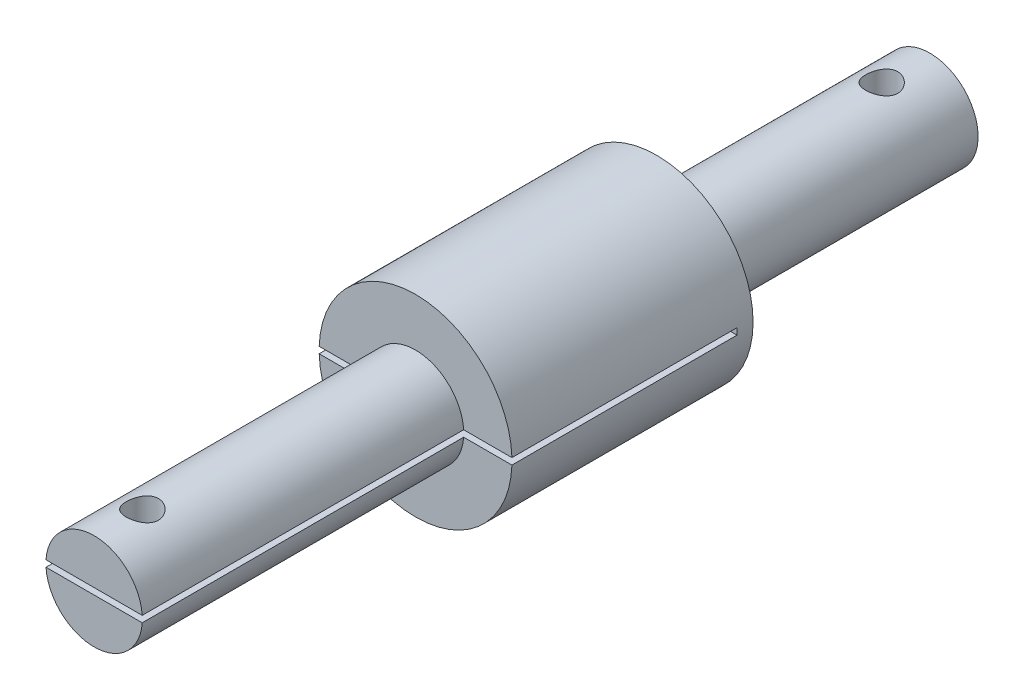
ISO-10303-21;
HEADER;
FILE_DESCRIPTION(('STEP AP214'),'2;1');
FILE_NAME('part.step','',(''),(''),'','','');
FILE_SCHEMA(('AUTOMOTIVE_DESIGN { 1 0 10303 214 1 1 1 1 }'));
ENDSEC;
DATA;
#1=APPLICATION_CONTEXT('core data for automotive mechanical design processes');
#2=APPLICATION_PROTOCOL_DEFINITION('international standard','automotive_design',2000,#1);
#3=PRODUCT_CONTEXT('',#1,'mechanical');
#4=PRODUCT('Part','Part','',(#3));
#5=PRODUCT_RELATED_PRODUCT_CATEGORY('part','',(#4));
#6=PRODUCT_DEFINITION_FORMATION('','',#4);
#7=PRODUCT_DEFINITION_CONTEXT('part definition',#1,'design');
#8=PRODUCT_DEFINITION('design','',#6,#7);
#9=PRODUCT_DEFINITION_SHAPE('','',#8);
#10=(LENGTH_UNIT() NAMED_UNIT(*) SI_UNIT(.MILLI.,.METRE.));
#11=(NAMED_UNIT(*) PLANE_ANGLE_UNIT() SI_UNIT($,.RADIAN.));
#12=(NAMED_UNIT(*) SI_UNIT($,.STERADIAN.) SOLID_ANGLE_UNIT());
#13=UNCERTAINTY_MEASURE_WITH_UNIT(LENGTH_MEASURE(1.E-05),#10,'distance_accuracy_value','');
#14=(GEOMETRIC_REPRESENTATION_CONTEXT(3) GLOBAL_UNCERTAINTY_ASSIGNED_CONTEXT((#13)) GLOBAL_UNIT_ASSIGNED_CONTEXT((#10,
#11,#12)) REPRESENTATION_CONTEXT('',''));
#15=CARTESIAN_POINT('',(0.,0.,0.));
#16=DIRECTION('',(0.,0.,1.));
#17=DIRECTION('',(1.,0.,0.));
#18=AXIS2_PLACEMENT_3D('',#15,#16,#17);
#19=CARTESIAN_POINT('',(0.,0.,35.));
#20=DIRECTION('',(0.,0.,-1.));
#21=DIRECTION('',(-1.,0.,0.));
#22=AXIS2_PLACEMENT_3D('',#19,#20,#21);
#23=CYLINDRICAL_SURFACE('',#22,3.);
#24=CARTESIAN_POINT('',(0.,3.,31.));
#25=CARTESIAN_POINT('',(-0.0545633628867235,3.00000015300943,30.9999997462684));
#26=CARTESIAN_POINT('',(-0.10912519453855,2.99849769507545,31.0044802661272));
#27=CARTESIAN_POINT('',(-0.216641760872973,2.99265210203281,31.0222291088172));
#28=CARTESIAN_POINT('',(-0.269596328118818,2.98830867202153,31.0354983439489));
#29=CARTESIAN_POINT('',(-0.372332789501776,2.97725307906443,31.0703192433841));
#30=CARTESIAN_POINT('',(-0.422119825886035,2.97054487730853,31.0918570624593));
#31=CARTESIAN_POINT('',(-0.517374936805325,2.95544445717342,31.1425411728383));
#32=CARTESIAN_POINT('',(-0.562842156958706,2.94705190667778,31.1716889650026));
#33=CARTESIAN_POINT('',(-0.649741675022266,2.92914094443005,31.2378258048588));
#34=CARTESIAN_POINT('',(-0.69100370029831,2.91959556463785,31.2750312342605));
#35=CARTESIAN_POINT('',(-0.766832692702084,2.90060314783121,31.3557671547066));
#36=CARTESIAN_POINT('',(-0.801398185489462,2.89115613290549,31.3992990349285));
#37=CARTESIAN_POINT('',(-0.863824942227858,2.87313332477274,31.4929851151965));
#38=CARTESIAN_POINT('',(-0.891464858221032,2.86459039275688,31.5432937397321));
#39=CARTESIAN_POINT('',(-0.937818873877722,2.84975305418601,31.6481760944586));
#40=CARTESIAN_POINT('',(-0.956535697386767,2.84345796160746,31.7027485171627));
#41=CARTESIAN_POINT('',(-0.983873461509166,2.83411303269377,31.8126732214967));
#42=CARTESIAN_POINT('',(-0.992813448271772,2.83096095769611,31.8679372084891));
#43=CARTESIAN_POINT('',(-1.00134112333448,2.82795656629508,31.9792637541559));
#44=CARTESIAN_POINT('',(-1.00093170160472,2.8281032302273,32.0353260607092));
#45=CARTESIAN_POINT('',(-0.991019903703419,2.8315901500818,32.143936630444));
#46=CARTESIAN_POINT('',(-0.981933913166995,2.83478415867533,32.196528402919));
#47=CARTESIAN_POINT('',(-0.955606162849417,2.84376657724551,32.2993934196068));
#48=CARTESIAN_POINT('',(-0.938363426591871,2.84955529784108,32.3496663854351));
#49=CARTESIAN_POINT('',(-0.895939058060212,2.86317911131249,32.4474127495915));
#50=CARTESIAN_POINT('',(-0.870634048707264,2.87104565793117,32.4948280254695));
#51=CARTESIAN_POINT('',(-0.81288910630314,2.88792558575726,32.5848709082797));
#52=CARTESIAN_POINT('',(-0.780447112364006,2.89693929790464,32.6274971269334));
#53=CARTESIAN_POINT('',(-0.707349332682236,2.91567329167741,32.7090915981608));
#54=CARTESIAN_POINT('',(-0.666353150076309,2.92540589354843,32.7477526945091));
#55=CARTESIAN_POINT('',(-0.578339569970061,2.94406938387037,32.8177312666634));
#56=CARTESIAN_POINT('',(-0.531321595660812,2.95300019538067,32.8490480381645));
#57=CARTESIAN_POINT('',(-0.431947613046266,2.96917107937794,32.9036963002351));
#58=CARTESIAN_POINT('',(-0.379543276416335,2.97639350008039,32.9269454913407));
#59=CARTESIAN_POINT('',(-0.271269083364506,2.98820567144435,32.9642031739557));
#60=CARTESIAN_POINT('',(-0.215400438154953,2.99279633654879,32.9782148754234));
#61=CARTESIAN_POINT('',(-0.104383829529304,2.99867627071441,32.9960556660224));
#62=CARTESIAN_POINT('',(-0.0493095998648451,3.00010001833731,33.0002998091728));
#63=CARTESIAN_POINT('',(0.0607750699602367,2.99988902694825,32.9996673264015));
#64=CARTESIAN_POINT('',(0.115785519319647,2.99825480419352,32.9947922400201));
#65=CARTESIAN_POINT('',(0.22251986630426,2.99220024717114,32.976388092264));
#66=CARTESIAN_POINT('',(0.274292806834859,2.98786198711228,32.9631137939505));
#67=CARTESIAN_POINT('',(0.374855958579563,2.97691846830034,32.9286065555333));
#68=CARTESIAN_POINT('',(0.423645788508561,2.97031292046541,32.9073726005323));
#69=CARTESIAN_POINT('',(0.518288296393322,2.95528931287427,32.8569295681591));
#70=CARTESIAN_POINT('',(0.564029959217331,2.94682814756305,32.8275254067164));
#71=CARTESIAN_POINT('',(0.650064830135405,2.92905253915743,32.7618058499869));
#72=CARTESIAN_POINT('',(0.690356367794894,2.91973783591888,32.7254883439698));
#73=CARTESIAN_POINT('',(0.766252507807013,2.90076847982472,32.6450212489917));
#74=CARTESIAN_POINT('',(0.80156096924849,2.89111761095155,32.6005907730668));
#75=CARTESIAN_POINT('',(0.864257522320852,2.87299973286981,32.5062284321955));
#76=CARTESIAN_POINT('',(0.891645547920841,2.8645327335312,32.4562965213898));
#77=CARTESIAN_POINT('',(0.937596930423359,2.84982391820308,32.3523269846934));
#78=CARTESIAN_POINT('',(0.956178132197765,2.84357760900632,32.2982979207572));
#79=CARTESIAN_POINT('',(0.983894666792163,2.83410832399133,32.1876213498759));
#80=CARTESIAN_POINT('',(0.993034254961244,2.83088398622698,32.1309750345669));
#81=CARTESIAN_POINT('',(1.00127628247038,2.82797858875071,32.0198029039868));
#82=CARTESIAN_POINT('',(1.00087025731093,2.82812400344299,31.9653176597483));
#83=CARTESIAN_POINT('',(0.991242293454879,2.8315126992356,31.8572349251003));
#84=CARTESIAN_POINT('',(0.982020879458888,2.83475579595884,31.8036373820471));
#85=CARTESIAN_POINT('',(0.955371813126982,2.84384524278943,31.6998643369873));
#86=CARTESIAN_POINT('',(0.938103346014882,2.84964098015514,31.6496431749928));
#87=CARTESIAN_POINT('',(0.895979365760382,2.86316398825434,31.5527725930645));
#88=CARTESIAN_POINT('',(0.871122168553976,2.87089168765297,31.5061239688127));
#89=CARTESIAN_POINT('',(0.813260692583244,2.8878282922406,31.4155163300763));
#90=CARTESIAN_POINT('',(0.779948242764528,2.89708711641604,31.3717634981014));
#91=CARTESIAN_POINT('',(0.706642883135695,2.91583356283786,31.290310186616));
#92=CARTESIAN_POINT('',(0.666648084451494,2.92532124912518,31.252611424312));
#93=CARTESIAN_POINT('',(0.579241556920675,2.94390030525393,31.1828555877108));
#94=CARTESIAN_POINT('',(0.531601513499725,2.95296181801216,31.151075652249));
#95=CARTESIAN_POINT('',(0.431357357406628,2.96925991172652,31.0960095711494));
#96=CARTESIAN_POINT('',(0.378754518132348,2.9764969590794,31.072721254078));
#97=CARTESIAN_POINT('',(0.272493647200973,2.98805515068532,31.0362783675113));
#98=CARTESIAN_POINT('',(0.218987757676407,2.9924921242252,31.0227175337366));
#99=CARTESIAN_POINT('',(0.110320416010247,2.99846407064225,31.0045797193229));
#100=CARTESIAN_POINT('',(0.0551594255687462,2.99999984531906,31.0000002565035));
#101=CARTESIAN_POINT('',(0.,3.,31.));
#102=B_SPLINE_CURVE_WITH_KNOTS('',3,(#24,#25,#26,#27,#28,#29,#30,#31,#32,#33,#34,#35,#36,#37,
#38,#39,#40,#41,#42,#43,#44,#45,#46,#47,#48,#49,#50,#51,#52,#53,#54,#55,#56,#57,#58,#59,#60,#61,
#62,#63,#64,#65,#66,#67,#68,#69,#70,#71,#72,#73,#74,#75,#76,#77,#78,#79,#80,#81,#82,#83,#84,#85,
#86,#87,#88,#89,#90,#91,#92,#93,#94,#95,#96,#97,#98,#99,#100,#101),.UNSPECIFIED.,.T.,.F.,(4,2,2,
2,2,2,2,2,2,2,2,2,2,2,2,2,2,2,2,2,2,2,2,2,2,2,2,2,2,2,2,2,2,2,2,2,2,2,4),(0.,0.163487106026011,
0.326991185267521,0.490222672870275,0.653486377799101,0.821846842827558,0.9902443328753,
1.16348384823471,1.33667044692834,1.50401925741841,1.67131633987486,1.83096826551281,
1.99063930855482,2.15288171155131,2.31517102558208,2.48593305811368,2.65671145966619,
2.82918405650358,3.00159668877209,3.1665358317517,3.33144713164177,3.49158157978214,
3.65173645284104,3.81610399843737,3.98052180821892,4.15241022880751,4.32430008234996,
4.49584013824416,4.66730284700846,4.82995666056618,4.99260079341185,5.15215587070227,
5.31174638165789,5.47830066681616,5.64490211113589,5.81799660824911,5.99104681142267,
6.15636558363624,6.3216386602795),.UNSPECIFIED.);
#103=CARTESIAN_POINT('',(0.,3.,31.));
#104=VERTEX_POINT('',#103);
#105=EDGE_CURVE('E123',#104,#104,#102,.T.);
#106=ORIENTED_EDGE('',*,*,#105,.F.);
#107=EDGE_LOOP('',(#106));
#108=FACE_BOUND('',#107,.T.);
#109=CARTESIAN_POINT('',(0.,0.,35.));
#110=DIRECTION('',(0.,0.,1.));
#111=DIRECTION('',(1.,0.,0.));
#112=AXIS2_PLACEMENT_3D('',#109,#110,#111);
#113=CIRCLE('',#112,3.);
#114=CARTESIAN_POINT('',(2.99332590941915,0.2,35.));
#115=VERTEX_POINT('',#114);
#116=CARTESIAN_POINT('',(-2.99332590941916,0.2,35.));
#117=VERTEX_POINT('',#116);
#118=EDGE_CURVE('E117',#115,#117,#113,.T.);
#119=ORIENTED_EDGE('',*,*,#118,.F.);
#120=DIRECTION('',(0.,0.,-1.));
#121=VECTOR('',#120,1.);
#122=CARTESIAN_POINT('',(2.99332590941915,0.2,35.));
#123=LINE('',#122,#121);
#124=CARTESIAN_POINT('',(2.99332590941915,0.2,15.));
#125=VERTEX_POINT('',#124);
#126=EDGE_CURVE('E146',#115,#125,#123,.T.);
#127=ORIENTED_EDGE('',*,*,#126,.T.);
#128=CARTESIAN_POINT('',(0.,0.,15.));
#129=DIRECTION('',(0.,0.,1.));
#130=DIRECTION('',(1.,0.,0.));
#131=AXIS2_PLACEMENT_3D('',#128,#129,#130);
#132=CIRCLE('',#131,3.);
#133=CARTESIAN_POINT('',(-2.99332590941915,0.2,15.));
#134=VERTEX_POINT('',#133);
#135=EDGE_CURVE('E128',#125,#134,#132,.T.);
#136=ORIENTED_EDGE('',*,*,#135,.T.);
#137=DIRECTION('',(0.,0.,-1.));
#138=VECTOR('',#137,1.);
#139=CARTESIAN_POINT('',(-2.99332590941915,0.2,35.));
#140=LINE('',#139,#138);
#141=EDGE_CURVE('E240',#134,#117,#140,.F.);
#142=ORIENTED_EDGE('',*,*,#141,.T.);
#143=EDGE_LOOP('',(#119,#127,#136,#142));
#144=FACE_BOUND('',#143,.T.);
#145=ADVANCED_FACE('F35',(#108,#144),#23,.T.);
#146=CARTESIAN_POINT('',(0.,0.,15.));
#147=DIRECTION('',(0.,0.,1.));
#148=DIRECTION('',(1.,0.,0.));
#149=AXIS2_PLACEMENT_3D('',#146,#147,#148);
#150=PLANE('',#149);
#151=DIRECTION('',(-1.,0.,0.));
#152=VECTOR('',#151,1.);
#153=CARTESIAN_POINT('',(0.,0.2,15.));
#154=LINE('',#153,#152);
#155=CARTESIAN_POINT('',(5.99666574022598,0.2,15.));
#156=VERTEX_POINT('',#155);
#157=EDGE_CURVE('E58',#156,#125,#154,.T.);
#158=ORIENTED_EDGE('',*,*,#157,.F.);
#159=CARTESIAN_POINT('',(0.,0.,15.));
#160=DIRECTION('',(0.,0.,1.));
#161=DIRECTION('',(1.,0.,0.));
#162=AXIS2_PLACEMENT_3D('',#159,#160,#161);
#163=CIRCLE('',#162,6.);
#164=CARTESIAN_POINT('',(-5.99666574022598,0.2,15.));
#165=VERTEX_POINT('',#164);
#166=EDGE_CURVE('E131',#156,#165,#163,.T.);
#167=ORIENTED_EDGE('',*,*,#166,.T.);
#168=EDGE_CURVE('E229',#134,#165,#154,.T.);
#169=ORIENTED_EDGE('',*,*,#168,.F.);
#170=ORIENTED_EDGE('',*,*,#135,.F.);
#171=EDGE_LOOP('',(#158,#167,#169,#170));
#172=FACE_BOUND('',#171,.T.);
#173=ADVANCED_FACE('F173',(#172),#150,.T.);
#174=CARTESIAN_POINT('',(0.,0.,35.));
#175=DIRECTION('',(0.,0.,1.));
#176=DIRECTION('',(1.,0.,0.));
#177=AXIS2_PLACEMENT_3D('',#174,#175,#176);
#178=PLANE('',#177);
#179=DIRECTION('',(-1.,0.,0.));
#180=VECTOR('',#179,1.);
#181=CARTESIAN_POINT('',(-7.46051596763665,0.2,35.));
#182=LINE('',#181,#180);
#183=EDGE_CURVE('E104',#115,#117,#182,.T.);
#184=ORIENTED_EDGE('',*,*,#183,.F.);
#185=ORIENTED_EDGE('',*,*,#118,.T.);
#186=EDGE_LOOP('',(#184,#185));
#187=FACE_BOUND('',#186,.T.);
#188=ADVANCED_FACE('F171',(#187),#178,.T.);
#189=CARTESIAN_POINT('',(0.,10.,32.));
#190=DIRECTION('',(0.,-1.,0.));
#191=DIRECTION('',(0.,0.,-1.));
#192=AXIS2_PLACEMENT_3D('',#189,#190,#191);
#193=CYLINDRICAL_SURFACE('',#192,1.);
#194=CARTESIAN_POINT('',(0.,0.200000000000001,32.));
#195=DIRECTION('',(0.,1.,0.));
#196=DIRECTION('',(0.,0.,1.));
#197=AXIS2_PLACEMENT_3D('',#194,#195,#196);
#198=CIRCLE('',#197,1.);
#199=CARTESIAN_POINT('',(0.,0.200000000000001,33.));
#200=VERTEX_POINT('',#199);
#201=EDGE_CURVE('E227',#200,#200,#198,.T.);
#202=ORIENTED_EDGE('',*,*,#201,.F.);
#203=EDGE_LOOP('',(#202));
#204=FACE_BOUND('',#203,.T.);
#205=ORIENTED_EDGE('',*,*,#105,.T.);
#206=EDGE_LOOP('',(#205));
#207=FACE_BOUND('',#206,.T.);
#208=ADVANCED_FACE('F186',(#204,#207),#193,.F.);
#209=CARTESIAN_POINT('',(-2.99332590941915,-0.2,35.));
#210=VERTEX_POINT('',#209);
#211=CARTESIAN_POINT('',(2.99332590941915,-0.2,35.));
#212=VERTEX_POINT('',#211);
#213=EDGE_CURVE('E110',#210,#212,#113,.T.);
#214=ORIENTED_EDGE('',*,*,#213,.F.);
#215=DIRECTION('',(0.,0.,-1.));
#216=VECTOR('',#215,1.);
#217=CARTESIAN_POINT('',(-2.99332590941915,-0.2,35.));
#218=LINE('',#217,#216);
#219=CARTESIAN_POINT('',(-2.99332590941915,-0.2,15.));
#220=VERTEX_POINT('',#219);
#221=EDGE_CURVE('E50',#210,#220,#218,.T.);
#222=ORIENTED_EDGE('',*,*,#221,.T.);
#223=CARTESIAN_POINT('',(2.99332590941915,-0.2,15.));
#224=VERTEX_POINT('',#223);
#225=EDGE_CURVE('E112',#220,#224,#132,.T.);
#226=ORIENTED_EDGE('',*,*,#225,.T.);
#227=DIRECTION('',(0.,0.,-1.));
#228=VECTOR('',#227,1.);
#229=CARTESIAN_POINT('',(2.99332590941915,-0.2,35.));
#230=LINE('',#229,#228);
#231=EDGE_CURVE('E99',#224,#212,#230,.F.);
#232=ORIENTED_EDGE('',*,*,#231,.T.);
#233=EDGE_LOOP('',(#214,#222,#226,#232));
#234=FACE_BOUND('',#233,.T.);
#235=CARTESIAN_POINT('',(0.,-3.,31.));
#236=CARTESIAN_POINT('',(0.0545633628867235,-3.00000015300943,30.9999997462684));
#237=CARTESIAN_POINT('',(0.10912519453855,-2.99849769507545,31.0044802661272));
#238=CARTESIAN_POINT('',(0.216641760872973,-2.99265210203281,31.0222291088172));
#239=CARTESIAN_POINT('',(0.269596328118818,-2.98830867202153,31.0354983439489));
#240=CARTESIAN_POINT('',(0.372332789501776,-2.97725307906443,31.0703192433841));
#241=CARTESIAN_POINT('',(0.422119825886035,-2.97054487730853,31.0918570624593));
#242=CARTESIAN_POINT('',(0.517374936805325,-2.95544445717342,31.1425411728383));
#243=CARTESIAN_POINT('',(0.562842156958706,-2.94705190667778,31.1716889650026));
#244=CARTESIAN_POINT('',(0.649741675022266,-2.92914094443005,31.2378258048588));
#245=CARTESIAN_POINT('',(0.69100370029831,-2.91959556463785,31.2750312342605));
#246=CARTESIAN_POINT('',(0.766832692702084,-2.90060314783121,31.3557671547066));
#247=CARTESIAN_POINT('',(0.801398185489462,-2.89115613290549,31.3992990349285));
#248=CARTESIAN_POINT('',(0.863824942227858,-2.87313332477274,31.4929851151965));
#249=CARTESIAN_POINT('',(0.891464858221032,-2.86459039275688,31.5432937397321));
#250=CARTESIAN_POINT('',(0.937818873877722,-2.84975305418601,31.6481760944586));
#251=CARTESIAN_POINT('',(0.956535697386767,-2.84345796160746,31.7027485171627));
#252=CARTESIAN_POINT('',(0.983873461509166,-2.83411303269377,31.8126732214967));
#253=CARTESIAN_POINT('',(0.992813448271772,-2.83096095769611,31.8679372084891));
#254=CARTESIAN_POINT('',(1.00134112333448,-2.82795656629508,31.9792637541559));
#255=CARTESIAN_POINT('',(1.00093170160472,-2.8281032302273,32.0353260607092));
#256=CARTESIAN_POINT('',(0.991019903703419,-2.8315901500818,32.143936630444));
#257=CARTESIAN_POINT('',(0.981933913166995,-2.83478415867533,32.196528402919));
#258=CARTESIAN_POINT('',(0.955606162849417,-2.84376657724551,32.2993934196068));
#259=CARTESIAN_POINT('',(0.938363426591871,-2.84955529784108,32.3496663854351));
#260=CARTESIAN_POINT('',(0.895939058060212,-2.86317911131249,32.4474127495915));
#261=CARTESIAN_POINT('',(0.870634048707264,-2.87104565793117,32.4948280254695));
#262=CARTESIAN_POINT('',(0.81288910630314,-2.88792558575726,32.5848709082797));
#263=CARTESIAN_POINT('',(0.780447112364006,-2.89693929790464,32.6274971269334));
#264=CARTESIAN_POINT('',(0.707349332682236,-2.91567329167741,32.7090915981608));
#265=CARTESIAN_POINT('',(0.666353150076309,-2.92540589354843,32.7477526945091));
#266=CARTESIAN_POINT('',(0.578339569970061,-2.94406938387037,32.8177312666634));
#267=CARTESIAN_POINT('',(0.531321595660812,-2.95300019538067,32.8490480381645));
#268=CARTESIAN_POINT('',(0.431947613046266,-2.96917107937794,32.9036963002351));
#269=CARTESIAN_POINT('',(0.379543276416335,-2.97639350008039,32.9269454913407));
#270=CARTESIAN_POINT('',(0.271269083364506,-2.98820567144435,32.9642031739557));
#271=CARTESIAN_POINT('',(0.215400438154953,-2.99279633654879,32.9782148754234));
#272=CARTESIAN_POINT('',(0.104383829529304,-2.99867627071441,32.9960556660224));
#273=CARTESIAN_POINT('',(0.0493095998648451,-3.00010001833731,33.0002998091728));
#274=CARTESIAN_POINT('',(-0.0607750699602367,-2.99988902694825,32.9996673264015));
#275=CARTESIAN_POINT('',(-0.115785519319647,-2.99825480419352,32.9947922400201));
#276=CARTESIAN_POINT('',(-0.22251986630426,-2.99220024717114,32.976388092264));
#277=CARTESIAN_POINT('',(-0.274292806834859,-2.98786198711228,32.9631137939505));
#278=CARTESIAN_POINT('',(-0.374855958579563,-2.97691846830034,32.9286065555333));
#279=CARTESIAN_POINT('',(-0.423645788508561,-2.97031292046541,32.9073726005323));
#280=CARTESIAN_POINT('',(-0.518288296393322,-2.95528931287427,32.8569295681591));
#281=CARTESIAN_POINT('',(-0.564029959217331,-2.94682814756305,32.8275254067164));
#282=CARTESIAN_POINT('',(-0.650064830135405,-2.92905253915743,32.7618058499869));
#283=CARTESIAN_POINT('',(-0.690356367794894,-2.91973783591888,32.7254883439698));
#284=CARTESIAN_POINT('',(-0.766252507807013,-2.90076847982472,32.6450212489917));
#285=CARTESIAN_POINT('',(-0.80156096924849,-2.89111761095155,32.6005907730668));
#286=CARTESIAN_POINT('',(-0.864257522320852,-2.87299973286981,32.5062284321955));
#287=CARTESIAN_POINT('',(-0.891645547920841,-2.8645327335312,32.4562965213898));
#288=CARTESIAN_POINT('',(-0.937596930423359,-2.84982391820308,32.3523269846934));
#289=CARTESIAN_POINT('',(-0.956178132197765,-2.84357760900632,32.2982979207572));
#290=CARTESIAN_POINT('',(-0.983894666792163,-2.83410832399133,32.1876213498759));
#291=CARTESIAN_POINT('',(-0.993034254961244,-2.83088398622698,32.1309750345669));
#292=CARTESIAN_POINT('',(-1.00127628247038,-2.82797858875071,32.0198029039868));
#293=CARTESIAN_POINT('',(-1.00087025731093,-2.82812400344299,31.9653176597483));
#294=CARTESIAN_POINT('',(-0.991242293454879,-2.8315126992356,31.8572349251003));
#295=CARTESIAN_POINT('',(-0.982020879458888,-2.83475579595884,31.8036373820471));
#296=CARTESIAN_POINT('',(-0.955371813126982,-2.84384524278943,31.6998643369873));
#297=CARTESIAN_POINT('',(-0.938103346014882,-2.84964098015514,31.6496431749928));
#298=CARTESIAN_POINT('',(-0.895979365760382,-2.86316398825434,31.5527725930645));
#299=CARTESIAN_POINT('',(-0.871122168553976,-2.87089168765297,31.5061239688127));
#300=CARTESIAN_POINT('',(-0.813260692583244,-2.8878282922406,31.4155163300763));
#301=CARTESIAN_POINT('',(-0.779948242764528,-2.89708711641604,31.3717634981014));
#302=CARTESIAN_POINT('',(-0.706642883135695,-2.91583356283786,31.290310186616));
#303=CARTESIAN_POINT('',(-0.666648084451494,-2.92532124912518,31.252611424312));
#304=CARTESIAN_POINT('',(-0.579241556920675,-2.94390030525393,31.1828555877108));
#305=CARTESIAN_POINT('',(-0.531601513499725,-2.95296181801216,31.151075652249));
#306=CARTESIAN_POINT('',(-0.431357357406628,-2.96925991172652,31.0960095711494));
#307=CARTESIAN_POINT('',(-0.378754518132348,-2.9764969590794,31.072721254078));
#308=CARTESIAN_POINT('',(-0.272493647200973,-2.98805515068532,31.0362783675113));
#309=CARTESIAN_POINT('',(-0.218987757676407,-2.9924921242252,31.0227175337366));
#310=CARTESIAN_POINT('',(-0.110320416010247,-2.99846407064225,31.0045797193229));
#311=CARTESIAN_POINT('',(-0.0551594255687462,-2.99999984531906,31.0000002565035));
#312=CARTESIAN_POINT('',(0.,-3.,31.));
#313=B_SPLINE_CURVE_WITH_KNOTS('',3,(#235,#236,#237,#238,#239,#240,#241,#242,#243,#244,#245,
#246,#247,#248,#249,#250,#251,#252,#253,#254,#255,#256,#257,#258,#259,#260,#261,#262,#263,#264,
#265,#266,#267,#268,#269,#270,#271,#272,#273,#274,#275,#276,#277,#278,#279,#280,#281,#282,#283,
#284,#285,#286,#287,#288,#289,#290,#291,#292,#293,#294,#295,#296,#297,#298,#299,#300,#301,#302,
#303,#304,#305,#306,#307,#308,#309,#310,#311,#312),.UNSPECIFIED.,.T.,.F.,(4,2,2,2,2,2,2,2,2,2,2,
2,2,2,2,2,2,2,2,2,2,2,2,2,2,2,2,2,2,2,2,2,2,2,2,2,2,2,4),(0.,0.163487106026011,
0.326991185267521,0.490222672870275,0.653486377799101,0.821846842827558,0.9902443328753,
1.16348384823471,1.33667044692834,1.50401925741841,1.67131633987486,1.83096826551281,
1.99063930855482,2.15288171155131,2.31517102558208,2.48593305811368,2.65671145966619,
2.82918405650358,3.00159668877209,3.1665358317517,3.33144713164177,3.49158157978214,
3.65173645284104,3.81610399843737,3.98052180821892,4.15241022880751,4.32430008234996,
4.49584013824416,4.66730284700846,4.82995666056618,4.99260079341185,5.15215587070227,
5.31174638165789,5.47830066681616,5.64490211113589,5.81799660824911,5.99104681142267,
6.15636558363624,6.3216386602795),.UNSPECIFIED.);
#314=CARTESIAN_POINT('',(0.,-3.,31.));
#315=VERTEX_POINT('',#314);
#316=EDGE_CURVE('E214',#315,#315,#313,.T.);
#317=ORIENTED_EDGE('',*,*,#316,.F.);
#318=EDGE_LOOP('',(#317));
#319=FACE_BOUND('',#318,.T.);
#320=ADVANCED_FACE('F108',(#234,#319),#23,.T.);
#321=CARTESIAN_POINT('',(0.,0.,-17.));
#322=DIRECTION('',(0.,0.,1.));
#323=DIRECTION('',(1.,0.,0.));
#324=AXIS2_PLACEMENT_3D('',#321,#322,#323);
#325=CYLINDRICAL_SURFACE('',#324,3.);
#326=CARTESIAN_POINT('',(0.,0.,-17.));
#327=DIRECTION('',(0.,0.,-1.));
#328=DIRECTION('',(-1.,0.,0.));
#329=AXIS2_PLACEMENT_3D('',#326,#327,#328);
#330=CIRCLE('',#329,3.);
#331=CARTESIAN_POINT('',(-3.,0.,-17.));
#332=VERTEX_POINT('',#331);
#333=EDGE_CURVE('E118',#332,#332,#330,.T.);
#334=ORIENTED_EDGE('',*,*,#333,.F.);
#335=EDGE_LOOP('',(#334));
#336=FACE_BOUND('',#335,.T.);
#337=CARTESIAN_POINT('',(0.,0.,0.));
#338=DIRECTION('',(0.,0.,-1.));
#339=DIRECTION('',(-1.,0.,0.));
#340=AXIS2_PLACEMENT_3D('',#337,#338,#339);
#341=CIRCLE('',#340,3.);
#342=CARTESIAN_POINT('',(-3.,0.,0.));
#343=VERTEX_POINT('',#342);
#344=EDGE_CURVE('E127',#343,#343,#341,.T.);
#345=ORIENTED_EDGE('',*,*,#344,.T.);
#346=EDGE_LOOP('',(#345));
#347=FACE_BOUND('',#346,.T.);
#348=CARTESIAN_POINT('',(0.,-3.,-15.));
#349=CARTESIAN_POINT('',(0.0545633628867237,-3.00000015300943,-15.0000002537316));
#350=CARTESIAN_POINT('',(0.10912519453855,-2.99849769507545,-14.9955197338728));
#351=CARTESIAN_POINT('',(0.216641760872973,-2.99265210203281,-14.9777708911828));
#352=CARTESIAN_POINT('',(0.269596328118818,-2.98830867202153,-14.9645016560511));
#353=CARTESIAN_POINT('',(0.372332789501777,-2.97725307906443,-14.929680756616));
#354=CARTESIAN_POINT('',(0.422119825886035,-2.97054487730853,-14.9081429375407));
#355=CARTESIAN_POINT('',(0.517374936805326,-2.95544445717342,-14.8574588271617));
#356=CARTESIAN_POINT('',(0.562842156958706,-2.94705190667778,-14.8283110349974));
#357=CARTESIAN_POINT('',(0.649741675022267,-2.92914094443005,-14.7621741951412));
#358=CARTESIAN_POINT('',(0.69100370029831,-2.91959556463785,-14.7249687657395));
#359=CARTESIAN_POINT('',(0.766832692702085,-2.90060314783122,-14.6442328452934));
#360=CARTESIAN_POINT('',(0.801398185489464,-2.89115613290549,-14.6007009650715));
#361=CARTESIAN_POINT('',(0.86382494222786,-2.87313332477274,-14.5070148848035));
#362=CARTESIAN_POINT('',(0.891464858221033,-2.86459039275688,-14.4567062602679));
#363=CARTESIAN_POINT('',(0.937818873877723,-2.84975305418601,-14.3518239055415));
#364=CARTESIAN_POINT('',(0.956535697386766,-2.84345796160746,-14.2972514828373));
#365=CARTESIAN_POINT('',(0.983873461509165,-2.83411303269377,-14.1873267785033));
#366=CARTESIAN_POINT('',(0.99281344827177,-2.83096095769611,-14.1320627915109));
#367=CARTESIAN_POINT('',(1.00134112333448,-2.82795656629508,-14.0207362458441));
#368=CARTESIAN_POINT('',(1.00093170160472,-2.8281032302273,-13.9646739392908));
#369=CARTESIAN_POINT('',(0.99101990370342,-2.8315901500818,-13.856063369556));
#370=CARTESIAN_POINT('',(0.981933913166995,-2.83478415867533,-13.803471597081));
#371=CARTESIAN_POINT('',(0.955606162849417,-2.84376657724551,-13.7006065803932));
#372=CARTESIAN_POINT('',(0.938363426591871,-2.84955529784108,-13.6503336145649));
#373=CARTESIAN_POINT('',(0.895939058060211,-2.86317911131249,-13.5525872504085));
#374=CARTESIAN_POINT('',(0.870634048707263,-2.87104565793117,-13.5051719745305));
#375=CARTESIAN_POINT('',(0.81288910630314,-2.88792558575726,-13.4151290917203));
#376=CARTESIAN_POINT('',(0.780447112364007,-2.89693929790464,-13.3725028730666));
#377=CARTESIAN_POINT('',(0.707349332682239,-2.91567329167741,-13.2909084018392));
#378=CARTESIAN_POINT('',(0.666353150076313,-2.92540589354843,-13.2522473054909));
#379=CARTESIAN_POINT('',(0.578339569970065,-2.94406938387037,-13.1822687333366));
#380=CARTESIAN_POINT('',(0.531321595660816,-2.95300019538067,-13.1509519618355));
#381=CARTESIAN_POINT('',(0.431947613046268,-2.96917107937794,-13.0963036997649));
#382=CARTESIAN_POINT('',(0.379543276416337,-2.97639350008039,-13.0730545086593));
#383=CARTESIAN_POINT('',(0.271269083364508,-2.98820567144435,-13.0357968260443));
#384=CARTESIAN_POINT('',(0.215400438154955,-2.99279633654879,-13.0217851245766));
#385=CARTESIAN_POINT('',(0.104383829529305,-2.99867627071441,-13.0039443339776));
#386=CARTESIAN_POINT('',(0.0493095998648461,-3.00010001833731,-12.9997001908273));
#387=CARTESIAN_POINT('',(-0.0607750699602359,-2.99988902694825,-13.0003326735985));
#388=CARTESIAN_POINT('',(-0.115785519319647,-2.99825480419352,-13.0052077599799));
#389=CARTESIAN_POINT('',(-0.222519866304259,-2.99220024717114,-13.023611907736));
#390=CARTESIAN_POINT('',(-0.274292806834856,-2.98786198711228,-13.0368862060495));
#391=CARTESIAN_POINT('',(-0.37485595857956,-2.97691846830034,-13.0713934444667));
#392=CARTESIAN_POINT('',(-0.423645788508559,-2.97031292046541,-13.0926273994677));
#393=CARTESIAN_POINT('',(-0.518288296393321,-2.95528931287427,-13.1430704318409));
#394=CARTESIAN_POINT('',(-0.564029959217329,-2.94682814756305,-13.1724745932836));
#395=CARTESIAN_POINT('',(-0.650064830135403,-2.92905253915743,-13.2381941500131));
#396=CARTESIAN_POINT('',(-0.690356367794893,-2.91973783591888,-13.2745116560302));
#397=CARTESIAN_POINT('',(-0.766252507807014,-2.90076847982472,-13.3549787510083));
#398=CARTESIAN_POINT('',(-0.801560969248492,-2.89111761095155,-13.3994092269333));
#399=CARTESIAN_POINT('',(-0.864257522320854,-2.87299973286981,-13.4937715678045));
#400=CARTESIAN_POINT('',(-0.891645547920843,-2.8645327335312,-13.5437034786102));
#401=CARTESIAN_POINT('',(-0.937596930423361,-2.84982391820308,-13.6476730153066));
#402=CARTESIAN_POINT('',(-0.956178132197767,-2.84357760900632,-13.7017020792428));
#403=CARTESIAN_POINT('',(-0.983894666792163,-2.83410832399133,-13.8123786501242));
#404=CARTESIAN_POINT('',(-0.993034254961244,-2.83088398622698,-13.8690249654331));
#405=CARTESIAN_POINT('',(-1.00127628247038,-2.82797858875071,-13.9801970960132));
#406=CARTESIAN_POINT('',(-1.00087025731093,-2.82812400344299,-14.0346823402517));
#407=CARTESIAN_POINT('',(-0.991242293454878,-2.8315126992356,-14.1427650748997));
#408=CARTESIAN_POINT('',(-0.982020879458887,-2.83475579595884,-14.1963626179529));
#409=CARTESIAN_POINT('',(-0.95537181312698,-2.84384524278943,-14.3001356630127));
#410=CARTESIAN_POINT('',(-0.938103346014879,-2.84964098015514,-14.3503568250072));
#411=CARTESIAN_POINT('',(-0.895979365760382,-2.86316398825434,-14.4472274069355));
#412=CARTESIAN_POINT('',(-0.871122168553979,-2.87089168765297,-14.4938760311873));
#413=CARTESIAN_POINT('',(-0.813260692583249,-2.8878282922406,-14.5844836699237));
#414=CARTESIAN_POINT('',(-0.779948242764533,-2.89708711641604,-14.6282365018986));
#415=CARTESIAN_POINT('',(-0.706642883135698,-2.91583356283786,-14.709689813384));
#416=CARTESIAN_POINT('',(-0.666648084451495,-2.92532124912518,-14.747388575688));
#417=CARTESIAN_POINT('',(-0.579241556920674,-2.94390030525393,-14.8171444122892));
#418=CARTESIAN_POINT('',(-0.531601513499725,-2.95296181801216,-14.848924347751));
#419=CARTESIAN_POINT('',(-0.431357357406628,-2.96925991172652,-14.9039904288506));
#420=CARTESIAN_POINT('',(-0.378754518132349,-2.9764969590794,-14.927278745922));
#421=CARTESIAN_POINT('',(-0.272493647200975,-2.98805515068532,-14.9637216324887));
#422=CARTESIAN_POINT('',(-0.218987757676408,-2.9924921242252,-14.9772824662634));
#423=CARTESIAN_POINT('',(-0.110320416010247,-2.99846407064225,-14.9954202806771));
#424=CARTESIAN_POINT('',(-0.055159425568746,-2.99999984531906,-14.9999997434965));
#425=CARTESIAN_POINT('',(0.,-3.,-15.));
#426=B_SPLINE_CURVE_WITH_KNOTS('',3,(#348,#349,#350,#351,#352,#353,#354,#355,#356,#357,#358,
#359,#360,#361,#362,#363,#364,#365,#366,#367,#368,#369,#370,#371,#372,#373,#374,#375,#376,#377,
#378,#379,#380,#381,#382,#383,#384,#385,#386,#387,#388,#389,#390,#391,#392,#393,#394,#395,#396,
#397,#398,#399,#400,#401,#402,#403,#404,#405,#406,#407,#408,#409,#410,#411,#412,#413,#414,#415,
#416,#417,#418,#419,#420,#421,#422,#423,#424,#425),.UNSPECIFIED.,.T.,.F.,(4,2,2,2,2,2,2,2,2,2,2,
2,2,2,2,2,2,2,2,2,2,2,2,2,2,2,2,2,2,2,2,2,2,2,2,2,2,2,4),(0.,0.163487106026011,
0.326991185267521,0.490222672870274,0.653486377799101,0.821846842827561,0.990244332875303,
1.16348384823471,1.33667044692833,1.5040192574184,1.67131633987485,1.8309682655128,
1.99063930855482,2.15288171155131,2.31517102558207,2.48593305811367,2.65671145966618,
2.82918405650358,3.00159668877208,3.1665358317517,3.33144713164177,3.49158157978214,
3.65173645284104,3.81610399843737,3.98052180821891,4.15241022880752,4.32430008234997,
4.49584013824417,4.66730284700846,4.82995666056619,4.99260079341185,5.15215587070228,
5.31174638165788,5.47830066681615,5.64490211113589,5.81799660824911,5.99104681142266,
6.15636558363624,6.3216386602795),.UNSPECIFIED.);
#427=CARTESIAN_POINT('',(0.,-3.,-15.));
#428=VERTEX_POINT('',#427);
#429=EDGE_CURVE('E137',#428,#428,#426,.T.);
#430=ORIENTED_EDGE('',*,*,#429,.F.);
#431=EDGE_LOOP('',(#430));
#432=FACE_BOUND('',#431,.T.);
#433=CARTESIAN_POINT('',(0.,3.,-15.));
#434=CARTESIAN_POINT('',(-0.0545633628867229,3.00000015300943,-15.0000002537316));
#435=CARTESIAN_POINT('',(-0.109125194538549,2.99849769507545,-14.9955197338728));
#436=CARTESIAN_POINT('',(-0.216641760872972,2.99265210203281,-14.9777708911828));
#437=CARTESIAN_POINT('',(-0.269596328118818,2.98830867202153,-14.9645016560511));
#438=CARTESIAN_POINT('',(-0.372332789501776,2.97725307906443,-14.929680756616));
#439=CARTESIAN_POINT('',(-0.422119825886034,2.97054487730853,-14.9081429375407));
#440=CARTESIAN_POINT('',(-0.517374936805325,2.95544445717342,-14.8574588271617));
#441=CARTESIAN_POINT('',(-0.562842156958706,2.94705190667778,-14.8283110349974));
#442=CARTESIAN_POINT('',(-0.649741675022266,2.92914094443005,-14.7621741951412));
#443=CARTESIAN_POINT('',(-0.691003700298309,2.91959556463785,-14.7249687657395));
#444=CARTESIAN_POINT('',(-0.766832692702084,2.90060314783122,-14.6442328452934));
#445=CARTESIAN_POINT('',(-0.801398185489462,2.89115613290549,-14.6007009650715));
#446=CARTESIAN_POINT('',(-0.863824942227859,2.87313332477274,-14.5070148848035));
#447=CARTESIAN_POINT('',(-0.891464858221032,2.86459039275688,-14.4567062602679));
#448=CARTESIAN_POINT('',(-0.937818873877722,2.84975305418601,-14.3518239055415));
#449=CARTESIAN_POINT('',(-0.956535697386765,2.84345796160746,-14.2972514828373));
#450=CARTESIAN_POINT('',(-0.983873461509164,2.83411303269377,-14.1873267785033));
#451=CARTESIAN_POINT('',(-0.992813448271769,2.83096095769611,-14.1320627915109));
#452=CARTESIAN_POINT('',(-1.00134112333448,2.82795656629508,-14.0207362458441));
#453=CARTESIAN_POINT('',(-1.00093170160472,2.8281032302273,-13.9646739392908));
#454=CARTESIAN_POINT('',(-0.991019903703419,2.8315901500818,-13.856063369556));
#455=CARTESIAN_POINT('',(-0.981933913166994,2.83478415867533,-13.803471597081));
#456=CARTESIAN_POINT('',(-0.955606162849417,2.84376657724551,-13.7006065803932));
#457=CARTESIAN_POINT('',(-0.938363426591871,2.84955529784108,-13.6503336145649));
#458=CARTESIAN_POINT('',(-0.895939058060211,2.86317911131249,-13.5525872504085));
#459=CARTESIAN_POINT('',(-0.870634048707263,2.87104565793117,-13.5051719745305));
#460=CARTESIAN_POINT('',(-0.812889106303139,2.88792558575726,-13.4151290917203));
#461=CARTESIAN_POINT('',(-0.780447112364006,2.89693929790464,-13.3725028730666));
#462=CARTESIAN_POINT('',(-0.707349332682239,2.91567329167741,-13.2909084018392));
#463=CARTESIAN_POINT('',(-0.666353150076313,2.92540589354843,-13.2522473054909));
#464=CARTESIAN_POINT('',(-0.578339569970065,2.94406938387037,-13.1822687333366));
#465=CARTESIAN_POINT('',(-0.531321595660815,2.95300019538067,-13.1509519618355));
#466=CARTESIAN_POINT('',(-0.431947613046267,2.96917107937794,-13.0963036997649));
#467=CARTESIAN_POINT('',(-0.379543276416336,2.97639350008039,-13.0730545086593));
#468=CARTESIAN_POINT('',(-0.271269083364507,2.98820567144435,-13.0357968260443));
#469=CARTESIAN_POINT('',(-0.215400438154954,2.99279633654879,-13.0217851245766));
#470=CARTESIAN_POINT('',(-0.104383829529304,2.99867627071441,-13.0039443339776));
#471=CARTESIAN_POINT('',(-0.0493095998648451,3.00010001833731,-12.9997001908273));
#472=CARTESIAN_POINT('',(0.0607750699602368,2.99988902694825,-13.0003326735985));
#473=CARTESIAN_POINT('',(0.115785519319647,2.99825480419352,-13.0052077599799));
#474=CARTESIAN_POINT('',(0.222519866304259,2.99220024717114,-13.023611907736));
#475=CARTESIAN_POINT('',(0.274292806834856,2.98786198711228,-13.0368862060495));
#476=CARTESIAN_POINT('',(0.374855958579561,2.97691846830034,-13.0713934444667));
#477=CARTESIAN_POINT('',(0.42364578850856,2.97031292046541,-13.0926273994677));
#478=CARTESIAN_POINT('',(0.518288296393322,2.95528931287427,-13.1430704318409));
#479=CARTESIAN_POINT('',(0.56402995921733,2.94682814756305,-13.1724745932836));
#480=CARTESIAN_POINT('',(0.650064830135404,2.92905253915743,-13.2381941500131));
#481=CARTESIAN_POINT('',(0.690356367794894,2.91973783591888,-13.2745116560302));
#482=CARTESIAN_POINT('',(0.766252507807014,2.90076847982472,-13.3549787510083));
#483=CARTESIAN_POINT('',(0.801560969248493,2.89111761095155,-13.3994092269333));
#484=CARTESIAN_POINT('',(0.864257522320855,2.87299973286981,-13.4937715678045));
#485=CARTESIAN_POINT('',(0.891645547920844,2.8645327335312,-13.5437034786102));
#486=CARTESIAN_POINT('',(0.937596930423362,2.84982391820308,-13.6476730153066));
#487=CARTESIAN_POINT('',(0.956178132197767,2.84357760900632,-13.7017020792428));
#488=CARTESIAN_POINT('',(0.983894666792164,2.83410832399133,-13.8123786501242));
#489=CARTESIAN_POINT('',(0.993034254961245,2.83088398622698,-13.8690249654331));
#490=CARTESIAN_POINT('',(1.00127628247038,2.82797858875071,-13.9801970960132));
#491=CARTESIAN_POINT('',(1.00087025731093,2.82812400344299,-14.0346823402517));
#492=CARTESIAN_POINT('',(0.991242293454878,2.8315126992356,-14.1427650748997));
#493=CARTESIAN_POINT('',(0.982020879458888,2.83475579595884,-14.1963626179529));
#494=CARTESIAN_POINT('',(0.955371813126981,2.84384524278943,-14.3001356630127));
#495=CARTESIAN_POINT('',(0.938103346014881,2.84964098015514,-14.3503568250072));
#496=CARTESIAN_POINT('',(0.895979365760383,2.86316398825434,-14.4472274069355));
#497=CARTESIAN_POINT('',(0.87112216855398,2.87089168765297,-14.4938760311873));
#498=CARTESIAN_POINT('',(0.81326069258325,2.8878282922406,-14.5844836699237));
#499=CARTESIAN_POINT('',(0.779948242764534,2.89708711641604,-14.6282365018986));
#500=CARTESIAN_POINT('',(0.706642883135699,2.91583356283786,-14.709689813384));
#501=CARTESIAN_POINT('',(0.666648084451496,2.92532124912518,-14.747388575688));
#502=CARTESIAN_POINT('',(0.579241556920675,2.94390030525393,-14.8171444122892));
#503=CARTESIAN_POINT('',(0.531601513499726,2.95296181801216,-14.848924347751));
#504=CARTESIAN_POINT('',(0.431357357406629,2.96925991172652,-14.9039904288506));
#505=CARTESIAN_POINT('',(0.37875451813235,2.9764969590794,-14.927278745922));
#506=CARTESIAN_POINT('',(0.272493647200976,2.98805515068532,-14.9637216324887));
#507=CARTESIAN_POINT('',(0.218987757676409,2.9924921242252,-14.9772824662634));
#508=CARTESIAN_POINT('',(0.110320416010248,2.99846407064224,-14.9954202806771));
#509=CARTESIAN_POINT('',(0.0551594255687469,2.99999984531906,-14.9999997434965));
#510=CARTESIAN_POINT('',(0.,3.,-15.));
#511=B_SPLINE_CURVE_WITH_KNOTS('',3,(#433,#434,#435,#436,#437,#438,#439,#440,#441,#442,#443,
#444,#445,#446,#447,#448,#449,#450,#451,#452,#453,#454,#455,#456,#457,#458,#459,#460,#461,#462,
#463,#464,#465,#466,#467,#468,#469,#470,#471,#472,#473,#474,#475,#476,#477,#478,#479,#480,#481,
#482,#483,#484,#485,#486,#487,#488,#489,#490,#491,#492,#493,#494,#495,#496,#497,#498,#499,#500,
#501,#502,#503,#504,#505,#506,#507,#508,#509,#510),.UNSPECIFIED.,.T.,.F.,(4,2,2,2,2,2,2,2,2,2,2,
2,2,2,2,2,2,2,2,2,2,2,2,2,2,2,2,2,2,2,2,2,2,2,2,2,2,2,4),(0.,0.163487106026011,
0.326991185267521,0.490222672870274,0.653486377799101,0.821846842827561,0.990244332875303,
1.16348384823471,1.33667044692833,1.5040192574184,1.67131633987485,1.8309682655128,
1.99063930855482,2.15288171155131,2.31517102558207,2.48593305811367,2.65671145966618,
2.82918405650358,3.00159668877208,3.1665358317517,3.33144713164177,3.49158157978214,
3.65173645284104,3.81610399843737,3.98052180821891,4.15241022880752,4.32430008234997,
4.49584013824417,4.66730284700846,4.82995666056619,4.99260079341185,5.15215587070228,
5.31174638165788,5.47830066681615,5.64490211113589,5.81799660824911,5.99104681142266,
6.15636558363624,6.3216386602795),.UNSPECIFIED.);
#512=CARTESIAN_POINT('',(0.,3.,-15.));
#513=VERTEX_POINT('',#512);
#514=EDGE_CURVE('E145',#513,#513,#511,.T.);
#515=ORIENTED_EDGE('',*,*,#514,.F.);
#516=EDGE_LOOP('',(#515));
#517=FACE_BOUND('',#516,.T.);
#518=ADVANCED_FACE('F151',(#336,#347,#432,#517),#325,.T.);
#519=CARTESIAN_POINT('',(0.,0.,15.));
#520=DIRECTION('',(0.,0.,-1.));
#521=DIRECTION('',(-1.,0.,0.));
#522=AXIS2_PLACEMENT_3D('',#519,#520,#521);
#523=CYLINDRICAL_SURFACE('',#522,6.);
#524=CARTESIAN_POINT('',(0.,0.,1.));
#525=DIRECTION('',(0.,0.,1.));
#526=DIRECTION('',(1.,0.,0.));
#527=AXIS2_PLACEMENT_3D('',#524,#525,#526);
#528=CIRCLE('',#527,6.);
#529=CARTESIAN_POINT('',(-5.99666574022598,0.2,1.));
#530=VERTEX_POINT('',#529);
#531=CARTESIAN_POINT('',(-5.99666574022598,-0.2,1.));
#532=VERTEX_POINT('',#531);
#533=EDGE_CURVE('E11',#530,#532,#528,.T.);
#534=ORIENTED_EDGE('',*,*,#533,.F.);
#535=DIRECTION('',(0.,0.,-1.));
#536=VECTOR('',#535,1.);
#537=CARTESIAN_POINT('',(-5.99666574022598,0.2,15.));
#538=LINE('',#537,#536);
#539=EDGE_CURVE('E231',#530,#165,#538,.F.);
#540=ORIENTED_EDGE('',*,*,#539,.T.);
#541=ORIENTED_EDGE('',*,*,#166,.F.);
#542=DIRECTION('',(0.,0.,-1.));
#543=VECTOR('',#542,1.);
#544=CARTESIAN_POINT('',(5.99666574022598,0.2,15.));
#545=LINE('',#544,#543);
#546=CARTESIAN_POINT('',(5.99666574022598,0.2,1.));
#547=VERTEX_POINT('',#546);
#548=EDGE_CURVE('E243',#156,#547,#545,.T.);
#549=ORIENTED_EDGE('',*,*,#548,.T.);
#550=CARTESIAN_POINT('',(5.99666574022598,-0.2,1.));
#551=VERTEX_POINT('',#550);
#552=EDGE_CURVE('E39',#551,#547,#528,.T.);
#553=ORIENTED_EDGE('',*,*,#552,.F.);
#554=DIRECTION('',(0.,0.,-1.));
#555=VECTOR('',#554,1.);
#556=CARTESIAN_POINT('',(5.99666574022598,-0.2,15.));
#557=LINE('',#556,#555);
#558=CARTESIAN_POINT('',(5.99666574022598,-0.2,15.));
#559=VERTEX_POINT('',#558);
#560=EDGE_CURVE('E114',#551,#559,#557,.F.);
#561=ORIENTED_EDGE('',*,*,#560,.T.);
#562=CARTESIAN_POINT('',(-5.99666574022598,-0.2,15.));
#563=VERTEX_POINT('',#562);
#564=EDGE_CURVE('E134',#563,#559,#163,.T.);
#565=ORIENTED_EDGE('',*,*,#564,.F.);
#566=DIRECTION('',(0.,0.,-1.));
#567=VECTOR('',#566,1.);
#568=CARTESIAN_POINT('',(-5.99666574022598,-0.2,15.));
#569=LINE('',#568,#567);
#570=EDGE_CURVE('E233',#563,#532,#569,.T.);
#571=ORIENTED_EDGE('',*,*,#570,.T.);
#572=EDGE_LOOP('',(#534,#540,#541,#549,#553,#561,#565,#571));
#573=FACE_BOUND('',#572,.T.);
#574=CARTESIAN_POINT('',(0.,0.,0.));
#575=DIRECTION('',(0.,0.,1.));
#576=DIRECTION('',(1.,0.,0.));
#577=AXIS2_PLACEMENT_3D('',#574,#575,#576);
#578=CIRCLE('',#577,6.);
#579=CARTESIAN_POINT('',(6.,0.,0.));
#580=VERTEX_POINT('',#579);
#581=EDGE_CURVE('E121',#580,#580,#578,.T.);
#582=ORIENTED_EDGE('',*,*,#581,.T.);
#583=EDGE_LOOP('',(#582));
#584=FACE_BOUND('',#583,.T.);
#585=ADVANCED_FACE('F37',(#573,#584),#523,.T.);
#586=DIRECTION('',(1.,0.,0.));
#587=VECTOR('',#586,1.);
#588=CARTESIAN_POINT('',(0.,-0.2,15.));
#589=LINE('',#588,#587);
#590=EDGE_CURVE('E113',#563,#220,#589,.T.);
#591=ORIENTED_EDGE('',*,*,#590,.F.);
#592=ORIENTED_EDGE('',*,*,#564,.T.);
#593=EDGE_CURVE('E225',#224,#559,#589,.T.);
#594=ORIENTED_EDGE('',*,*,#593,.F.);
#595=ORIENTED_EDGE('',*,*,#225,.F.);
#596=EDGE_LOOP('',(#591,#592,#594,#595));
#597=FACE_BOUND('',#596,.T.);
#598=ADVANCED_FACE('F181',(#597),#150,.T.);
#599=CARTESIAN_POINT('',(0.,0.,0.));
#600=DIRECTION('',(0.,0.,1.));
#601=DIRECTION('',(1.,0.,0.));
#602=AXIS2_PLACEMENT_3D('',#599,#600,#601);
#603=PLANE('',#602);
#604=ORIENTED_EDGE('',*,*,#344,.F.);
#605=EDGE_LOOP('',(#604));
#606=FACE_BOUND('',#605,.T.);
#607=ORIENTED_EDGE('',*,*,#581,.F.);
#608=EDGE_LOOP('',(#607));
#609=FACE_BOUND('',#608,.T.);
#610=ADVANCED_FACE('F170',(#606,#609),#603,.F.);
#611=DIRECTION('',(1.,0.,0.));
#612=VECTOR('',#611,1.);
#613=CARTESIAN_POINT('',(-7.46051596763665,-0.2,35.));
#614=LINE('',#613,#612);
#615=EDGE_CURVE('E96',#210,#212,#614,.T.);
#616=ORIENTED_EDGE('',*,*,#615,.F.);
#617=ORIENTED_EDGE('',*,*,#213,.T.);
#618=EDGE_LOOP('',(#616,#617));
#619=FACE_BOUND('',#618,.T.);
#620=ADVANCED_FACE('F116',(#619),#178,.T.);
#621=CARTESIAN_POINT('',(0.,0.,-17.));
#622=DIRECTION('',(0.,0.,-1.));
#623=DIRECTION('',(-1.,0.,0.));
#624=AXIS2_PLACEMENT_3D('',#621,#622,#623);
#625=PLANE('',#624);
#626=ORIENTED_EDGE('',*,*,#333,.T.);
#627=EDGE_LOOP('',(#626));
#628=FACE_BOUND('',#627,.T.);
#629=ADVANCED_FACE('F160',(#628),#625,.T.);
#630=CARTESIAN_POINT('',(0.,10.,-14.));
#631=DIRECTION('',(0.,-1.,0.));
#632=DIRECTION('',(0.,0.,-1.));
#633=AXIS2_PLACEMENT_3D('',#630,#631,#632);
#634=CYLINDRICAL_SURFACE('',#633,1.);
#635=ORIENTED_EDGE('',*,*,#429,.T.);
#636=EDGE_LOOP('',(#635));
#637=FACE_BOUND('',#636,.T.);
#638=ORIENTED_EDGE('',*,*,#514,.T.);
#639=EDGE_LOOP('',(#638));
#640=FACE_BOUND('',#639,.T.);
#641=ADVANCED_FACE('F155',(#637,#640),#634,.F.);
#642=CARTESIAN_POINT('',(0.,-0.200000000000001,32.));
#643=DIRECTION('',(0.,-1.,0.));
#644=DIRECTION('',(0.,0.,-1.));
#645=AXIS2_PLACEMENT_3D('',#642,#643,#644);
#646=CIRCLE('',#645,1.);
#647=CARTESIAN_POINT('',(0.,-0.200000000000001,31.));
#648=VERTEX_POINT('',#647);
#649=EDGE_CURVE('E211',#648,#648,#646,.T.);
#650=ORIENTED_EDGE('',*,*,#649,.F.);
#651=EDGE_LOOP('',(#650));
#652=FACE_BOUND('',#651,.T.);
#653=ORIENTED_EDGE('',*,*,#316,.T.);
#654=EDGE_LOOP('',(#653));
#655=FACE_BOUND('',#654,.T.);
#656=ADVANCED_FACE('F159',(#652,#655),#193,.F.);
#657=CARTESIAN_POINT('',(0.,0.,1.));
#658=DIRECTION('',(0.,0.,1.));
#659=DIRECTION('',(1.,0.,0.));
#660=AXIS2_PLACEMENT_3D('',#657,#658,#659);
#661=PLANE('',#660);
#662=ORIENTED_EDGE('',*,*,#533,.T.);
#663=DIRECTION('',(1.,0.,0.));
#664=VECTOR('',#663,1.);
#665=CARTESIAN_POINT('',(-7.46051596763665,-0.2,1.));
#666=LINE('',#665,#664);
#667=EDGE_CURVE('E259',#532,#551,#666,.T.);
#668=ORIENTED_EDGE('',*,*,#667,.T.);
#669=ORIENTED_EDGE('',*,*,#552,.T.);
#670=DIRECTION('',(-1.,0.,0.));
#671=VECTOR('',#670,1.);
#672=CARTESIAN_POINT('',(-7.46051596763665,0.2,1.));
#673=LINE('',#672,#671);
#674=EDGE_CURVE('E226',#547,#530,#673,.T.);
#675=ORIENTED_EDGE('',*,*,#674,.T.);
#676=EDGE_LOOP('',(#662,#668,#669,#675));
#677=FACE_BOUND('',#676,.T.);
#678=ADVANCED_FACE('F200',(#677),#661,.T.);
#679=CARTESIAN_POINT('',(-7.46051596763665,0.2,1.));
#680=DIRECTION('',(0.,1.,0.));
#681=DIRECTION('',(0.,0.,1.));
#682=AXIS2_PLACEMENT_3D('',#679,#680,#681);
#683=PLANE('',#682);
#684=ORIENTED_EDGE('',*,*,#201,.T.);
#685=EDGE_LOOP('',(#684));
#686=FACE_BOUND('',#685,.T.);
#687=ORIENTED_EDGE('',*,*,#183,.T.);
#688=ORIENTED_EDGE('',*,*,#141,.F.);
#689=ORIENTED_EDGE('',*,*,#168,.T.);
#690=ORIENTED_EDGE('',*,*,#539,.F.);
#691=ORIENTED_EDGE('',*,*,#674,.F.);
#692=ORIENTED_EDGE('',*,*,#548,.F.);
#693=ORIENTED_EDGE('',*,*,#157,.T.);
#694=ORIENTED_EDGE('',*,*,#126,.F.);
#695=EDGE_LOOP('',(#687,#688,#689,#690,#691,#692,#693,#694));
#696=FACE_BOUND('',#695,.T.);
#697=ADVANCED_FACE('F205',(#686,#696),#683,.F.);
#698=CARTESIAN_POINT('',(-7.46051596763665,-0.2,1.));
#699=DIRECTION('',(0.,-1.,0.));
#700=DIRECTION('',(0.,0.,-1.));
#701=AXIS2_PLACEMENT_3D('',#698,#699,#700);
#702=PLANE('',#701);
#703=ORIENTED_EDGE('',*,*,#649,.T.);
#704=EDGE_LOOP('',(#703));
#705=FACE_BOUND('',#704,.T.);
#706=ORIENTED_EDGE('',*,*,#615,.T.);
#707=ORIENTED_EDGE('',*,*,#231,.F.);
#708=ORIENTED_EDGE('',*,*,#593,.T.);
#709=ORIENTED_EDGE('',*,*,#560,.F.);
#710=ORIENTED_EDGE('',*,*,#667,.F.);
#711=ORIENTED_EDGE('',*,*,#570,.F.);
#712=ORIENTED_EDGE('',*,*,#590,.T.);
#713=ORIENTED_EDGE('',*,*,#221,.F.);
#714=EDGE_LOOP('',(#706,#707,#708,#709,#710,#711,#712,#713));
#715=FACE_BOUND('',#714,.T.);
#716=ADVANCED_FACE('F98',(#705,#715),#702,.F.);
#717=CLOSED_SHELL('',(#145,#173,#188,#208,#320,#518,#585,#598,#610,#620,#629,#641,#656,#678,
#697,#716));
#718=MANIFOLD_SOLID_BREP('B2',#717);
#719=ADVANCED_BREP_SHAPE_REPRESENTATION('',(#18,#718),#14);
#720=SHAPE_DEFINITION_REPRESENTATION(#9,#719);
ENDSEC;
END-ISO-10303-21;
